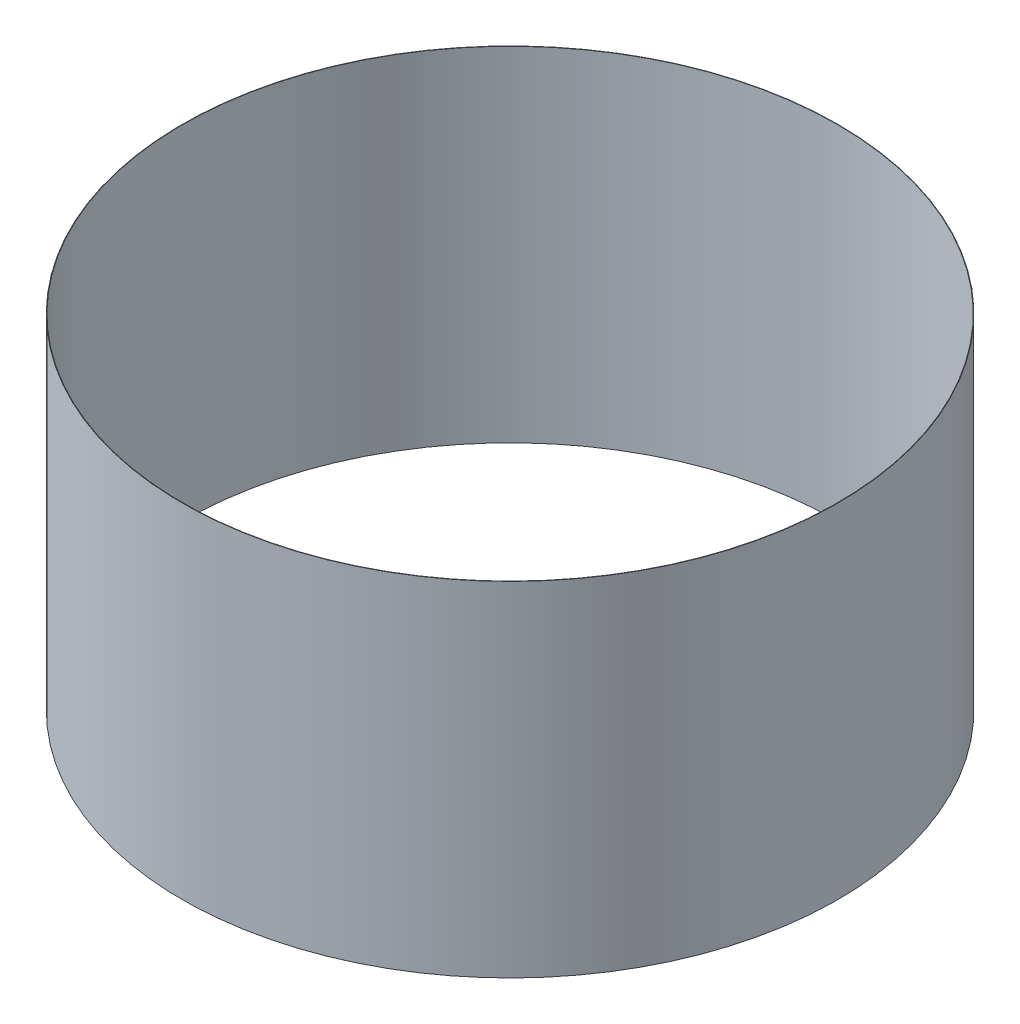
ISO-10303-21;
HEADER;
FILE_DESCRIPTION(('STEP AP214'),'2;1');
FILE_NAME('part.step','',(''),(''),'','','');
FILE_SCHEMA(('AUTOMOTIVE_DESIGN { 1 0 10303 214 1 1 1 1 }'));
ENDSEC;
DATA;
#1=APPLICATION_CONTEXT('core data for automotive mechanical design processes');
#2=APPLICATION_PROTOCOL_DEFINITION('international standard','automotive_design',2000,#1);
#3=PRODUCT_CONTEXT('',#1,'mechanical');
#4=PRODUCT('Part','Part','',(#3));
#5=PRODUCT_RELATED_PRODUCT_CATEGORY('part','',(#4));
#6=PRODUCT_DEFINITION_FORMATION('','',#4);
#7=PRODUCT_DEFINITION_CONTEXT('part definition',#1,'design');
#8=PRODUCT_DEFINITION('design','',#6,#7);
#9=PRODUCT_DEFINITION_SHAPE('','',#8);
#10=(LENGTH_UNIT() NAMED_UNIT(*) SI_UNIT(.MILLI.,.METRE.));
#11=(NAMED_UNIT(*) PLANE_ANGLE_UNIT() SI_UNIT($,.RADIAN.));
#12=(NAMED_UNIT(*) SI_UNIT($,.STERADIAN.) SOLID_ANGLE_UNIT());
#13=UNCERTAINTY_MEASURE_WITH_UNIT(LENGTH_MEASURE(1.E-05),#10,'distance_accuracy_value','');
#14=(GEOMETRIC_REPRESENTATION_CONTEXT(3) GLOBAL_UNCERTAINTY_ASSIGNED_CONTEXT((#13)) GLOBAL_UNIT_ASSIGNED_CONTEXT((#10,
#11,#12)) REPRESENTATION_CONTEXT('',''));
#15=CARTESIAN_POINT('',(0.,0.,0.));
#16=DIRECTION('',(0.,0.,1.));
#17=DIRECTION('',(1.,0.,0.));
#18=AXIS2_PLACEMENT_3D('',#15,#16,#17);
#19=CARTESIAN_POINT('',(0.,205.,0.));
#20=DIRECTION('',(0.,1.,0.));
#21=DIRECTION('',(0.,0.,1.));
#22=AXIS2_PLACEMENT_3D('',#19,#20,#21);
#23=PLANE('',#22);
#24=CARTESIAN_POINT('',(0.,205.,0.));
#25=DIRECTION('',(0.,1.,0.));
#26=DIRECTION('',(1.,0.,0.));
#27=AXIS2_PLACEMENT_3D('',#24,#25,#26);
#28=CIRCLE('',#27,195.75);
#29=CARTESIAN_POINT('',(0.,205.,-195.75));
#30=VERTEX_POINT('',#29);
#31=EDGE_CURVE('E11',#30,#30,#28,.T.);
#32=ORIENTED_EDGE('',*,*,#31,.T.);
#33=EDGE_LOOP('',(#32));
#34=FACE_BOUND('',#33,.T.);
#35=CARTESIAN_POINT('',(0.,205.,0.));
#36=DIRECTION('',(0.,1.,0.));
#37=DIRECTION('',(0.,0.,1.));
#38=AXIS2_PLACEMENT_3D('',#35,#36,#37);
#39=CIRCLE('',#38,195.5);
#40=CARTESIAN_POINT('',(0.,205.,-195.5));
#41=VERTEX_POINT('',#40);
#42=EDGE_CURVE('E48',#41,#41,#39,.T.);
#43=ORIENTED_EDGE('',*,*,#42,.F.);
#44=EDGE_LOOP('',(#43));
#45=FACE_BOUND('',#44,.T.);
#46=ADVANCED_FACE('F37',(#34,#45),#23,.T.);
#47=CARTESIAN_POINT('',(0.,0.,0.));
#48=DIRECTION('',(0.,1.,0.));
#49=DIRECTION('',(0.,0.,1.));
#50=AXIS2_PLACEMENT_3D('',#47,#48,#49);
#51=PLANE('',#50);
#52=CARTESIAN_POINT('',(0.,0.,0.));
#53=DIRECTION('',(0.,1.,0.));
#54=DIRECTION('',(1.,0.,0.));
#55=AXIS2_PLACEMENT_3D('',#52,#53,#54);
#56=CIRCLE('',#55,195.75);
#57=CARTESIAN_POINT('',(0.,0.,-195.75));
#58=VERTEX_POINT('',#57);
#59=EDGE_CURVE('E41',#58,#58,#56,.T.);
#60=ORIENTED_EDGE('',*,*,#59,.F.);
#61=EDGE_LOOP('',(#60));
#62=FACE_BOUND('',#61,.T.);
#63=CARTESIAN_POINT('',(0.,0.,0.));
#64=DIRECTION('',(0.,1.,0.));
#65=DIRECTION('',(0.,0.,1.));
#66=AXIS2_PLACEMENT_3D('',#63,#64,#65);
#67=CIRCLE('',#66,195.5);
#68=CARTESIAN_POINT('',(0.,0.,-195.5));
#69=VERTEX_POINT('',#68);
#70=EDGE_CURVE('E50',#69,#69,#67,.T.);
#71=ORIENTED_EDGE('',*,*,#70,.T.);
#72=EDGE_LOOP('',(#71));
#73=FACE_BOUND('',#72,.T.);
#74=ADVANCED_FACE('F60',(#62,#73),#51,.F.);
#75=CARTESIAN_POINT('',(0.,205.,0.));
#76=DIRECTION('',(0.,-1.,0.));
#77=DIRECTION('',(0.,0.,-1.));
#78=AXIS2_PLACEMENT_3D('',#75,#76,#77);
#79=CYLINDRICAL_SURFACE('',#78,195.75);
#80=CARTESIAN_POINT('',(0.,205.,-195.75));
#81=CARTESIAN_POINT('',(0.,202.864583333333,-195.75));
#82=CARTESIAN_POINT('',(0.,200.729166666667,-195.75));
#83=CARTESIAN_POINT('',(0.,196.458333333333,-195.75));
#84=CARTESIAN_POINT('',(0.,194.322916666667,-195.75));
#85=CARTESIAN_POINT('',(0.,190.052083333333,-195.75));
#86=CARTESIAN_POINT('',(0.,187.916666666667,-195.75));
#87=CARTESIAN_POINT('',(0.,183.645833333333,-195.75));
#88=CARTESIAN_POINT('',(0.,181.510416666667,-195.75));
#89=CARTESIAN_POINT('',(0.,177.239583333333,-195.75));
#90=CARTESIAN_POINT('',(0.,175.104166666667,-195.75));
#91=CARTESIAN_POINT('',(0.,170.833333333333,-195.75));
#92=CARTESIAN_POINT('',(0.,168.697916666667,-195.75));
#93=CARTESIAN_POINT('',(0.,164.427083333333,-195.75));
#94=CARTESIAN_POINT('',(0.,162.291666666667,-195.75));
#95=CARTESIAN_POINT('',(0.,158.020833333333,-195.75));
#96=CARTESIAN_POINT('',(0.,155.885416666667,-195.75));
#97=CARTESIAN_POINT('',(0.,151.614583333333,-195.75));
#98=CARTESIAN_POINT('',(0.,149.479166666667,-195.75));
#99=CARTESIAN_POINT('',(0.,145.208333333333,-195.75));
#100=CARTESIAN_POINT('',(0.,143.072916666667,-195.75));
#101=CARTESIAN_POINT('',(0.,138.802083333333,-195.75));
#102=CARTESIAN_POINT('',(0.,136.666666666667,-195.75));
#103=CARTESIAN_POINT('',(0.,132.395833333333,-195.75));
#104=CARTESIAN_POINT('',(0.,130.260416666667,-195.75));
#105=CARTESIAN_POINT('',(0.,125.989583333333,-195.75));
#106=CARTESIAN_POINT('',(0.,123.854166666667,-195.75));
#107=CARTESIAN_POINT('',(0.,119.583333333333,-195.75));
#108=CARTESIAN_POINT('',(0.,117.447916666667,-195.75));
#109=CARTESIAN_POINT('',(0.,113.177083333333,-195.75));
#110=CARTESIAN_POINT('',(0.,111.041666666667,-195.75));
#111=CARTESIAN_POINT('',(0.,106.770833333333,-195.75));
#112=CARTESIAN_POINT('',(0.,104.635416666667,-195.75));
#113=CARTESIAN_POINT('',(0.,100.364583333333,-195.75));
#114=CARTESIAN_POINT('',(0.,98.2291666666666,-195.75));
#115=CARTESIAN_POINT('',(0.,93.9583333333333,-195.75));
#116=CARTESIAN_POINT('',(0.,91.8229166666666,-195.75));
#117=CARTESIAN_POINT('',(0.,87.5520833333333,-195.75));
#118=CARTESIAN_POINT('',(0.,85.4166666666666,-195.75));
#119=CARTESIAN_POINT('',(0.,81.1458333333333,-195.75));
#120=CARTESIAN_POINT('',(0.,79.0104166666667,-195.75));
#121=CARTESIAN_POINT('',(0.,74.7395833333333,-195.75));
#122=CARTESIAN_POINT('',(0.,72.6041666666667,-195.75));
#123=CARTESIAN_POINT('',(0.,68.3333333333333,-195.75));
#124=CARTESIAN_POINT('',(0.,66.1979166666667,-195.75));
#125=CARTESIAN_POINT('',(0.,61.9270833333333,-195.75));
#126=CARTESIAN_POINT('',(0.,59.7916666666667,-195.75));
#127=CARTESIAN_POINT('',(0.,55.5208333333333,-195.75));
#128=CARTESIAN_POINT('',(0.,53.3854166666667,-195.75));
#129=CARTESIAN_POINT('',(0.,49.1145833333333,-195.75));
#130=CARTESIAN_POINT('',(0.,46.9791666666667,-195.75));
#131=CARTESIAN_POINT('',(0.,42.7083333333333,-195.75));
#132=CARTESIAN_POINT('',(0.,40.5729166666667,-195.75));
#133=CARTESIAN_POINT('',(0.,36.3020833333333,-195.75));
#134=CARTESIAN_POINT('',(0.,34.1666666666667,-195.75));
#135=CARTESIAN_POINT('',(0.,29.8958333333333,-195.75));
#136=CARTESIAN_POINT('',(0.,27.7604166666667,-195.75));
#137=CARTESIAN_POINT('',(0.,23.4895833333333,-195.75));
#138=CARTESIAN_POINT('',(0.,21.3541666666667,-195.75));
#139=CARTESIAN_POINT('',(0.,17.0833333333333,-195.75));
#140=CARTESIAN_POINT('',(0.,14.9479166666667,-195.75));
#141=CARTESIAN_POINT('',(0.,10.6770833333333,-195.75));
#142=CARTESIAN_POINT('',(0.,8.54166666666667,-195.75));
#143=CARTESIAN_POINT('',(0.,4.27083333333333,-195.75));
#144=CARTESIAN_POINT('',(0.,2.13541666666667,-195.75));
#145=CARTESIAN_POINT('',(0.,0.,-195.75));
#146=B_SPLINE_CURVE_WITH_KNOTS('',3,(#80,#81,#82,#83,#84,#85,#86,#87,#88,#89,#90,#91,#92,#93,
#94,#95,#96,#97,#98,#99,#100,#101,#102,#103,#104,#105,#106,#107,#108,#109,#110,#111,#112,#113,
#114,#115,#116,#117,#118,#119,#120,#121,#122,#123,#124,#125,#126,#127,#128,#129,#130,#131,#132,
#133,#134,#135,#136,#137,#138,#139,#140,#141,#142,#143,#144,#145),.UNSPECIFIED.,.F.,.F.,(4,2,2,
2,2,2,2,2,2,2,2,2,2,2,2,2,2,2,2,2,2,2,2,2,2,2,2,2,2,2,2,2,4),(0.,6.40625,12.8125,19.21875,
25.625,32.03125,38.4375,44.84375,51.25,57.65625,64.0625,70.46875,76.875,83.28125,89.6875,
96.09375,102.5,108.90625,115.3125,121.71875,128.125,134.53125,140.9375,147.34375,153.75,
160.15625,166.5625,172.96875,179.375,185.78125,192.1875,198.59375,205.),.UNSPECIFIED.);
#147=EDGE_CURVE('BSEAM39',#30,#58,#146,.T.);
#148=ORIENTED_EDGE('',*,*,#31,.F.);
#149=ORIENTED_EDGE('',*,*,#59,.T.);
#150=ORIENTED_EDGE('',*,*,#147,.T.);
#151=ORIENTED_EDGE('',*,*,#147,.F.);
#152=EDGE_LOOP('',(#148,#150,#149,#151));
#153=FACE_BOUND('',#152,.T.);
#154=ADVANCED_FACE('F39',(#153),#79,.T.);
#155=CARTESIAN_POINT('',(0.,205.,0.));
#156=DIRECTION('',(0.,-1.,0.));
#157=DIRECTION('',(0.,0.,-1.));
#158=AXIS2_PLACEMENT_3D('',#155,#156,#157);
#159=CYLINDRICAL_SURFACE('',#158,195.5);
#160=CARTESIAN_POINT('',(0.,205.,-195.5));
#161=CARTESIAN_POINT('',(0.,202.864583333333,-195.5));
#162=CARTESIAN_POINT('',(0.,200.729166666667,-195.5));
#163=CARTESIAN_POINT('',(0.,196.458333333333,-195.5));
#164=CARTESIAN_POINT('',(0.,194.322916666667,-195.5));
#165=CARTESIAN_POINT('',(0.,190.052083333333,-195.5));
#166=CARTESIAN_POINT('',(0.,187.916666666667,-195.5));
#167=CARTESIAN_POINT('',(0.,183.645833333333,-195.5));
#168=CARTESIAN_POINT('',(0.,181.510416666667,-195.5));
#169=CARTESIAN_POINT('',(0.,177.239583333333,-195.5));
#170=CARTESIAN_POINT('',(0.,175.104166666667,-195.5));
#171=CARTESIAN_POINT('',(0.,170.833333333333,-195.5));
#172=CARTESIAN_POINT('',(0.,168.697916666667,-195.5));
#173=CARTESIAN_POINT('',(0.,164.427083333333,-195.5));
#174=CARTESIAN_POINT('',(0.,162.291666666667,-195.5));
#175=CARTESIAN_POINT('',(0.,158.020833333333,-195.5));
#176=CARTESIAN_POINT('',(0.,155.885416666667,-195.5));
#177=CARTESIAN_POINT('',(0.,151.614583333333,-195.5));
#178=CARTESIAN_POINT('',(0.,149.479166666667,-195.5));
#179=CARTESIAN_POINT('',(0.,145.208333333333,-195.5));
#180=CARTESIAN_POINT('',(0.,143.072916666667,-195.5));
#181=CARTESIAN_POINT('',(0.,138.802083333333,-195.5));
#182=CARTESIAN_POINT('',(0.,136.666666666667,-195.5));
#183=CARTESIAN_POINT('',(0.,132.395833333333,-195.5));
#184=CARTESIAN_POINT('',(0.,130.260416666667,-195.5));
#185=CARTESIAN_POINT('',(0.,125.989583333333,-195.5));
#186=CARTESIAN_POINT('',(0.,123.854166666667,-195.5));
#187=CARTESIAN_POINT('',(0.,119.583333333333,-195.5));
#188=CARTESIAN_POINT('',(0.,117.447916666667,-195.5));
#189=CARTESIAN_POINT('',(0.,113.177083333333,-195.5));
#190=CARTESIAN_POINT('',(0.,111.041666666667,-195.5));
#191=CARTESIAN_POINT('',(0.,106.770833333333,-195.5));
#192=CARTESIAN_POINT('',(0.,104.635416666667,-195.5));
#193=CARTESIAN_POINT('',(0.,100.364583333333,-195.5));
#194=CARTESIAN_POINT('',(0.,98.2291666666666,-195.5));
#195=CARTESIAN_POINT('',(0.,93.9583333333333,-195.5));
#196=CARTESIAN_POINT('',(0.,91.8229166666666,-195.5));
#197=CARTESIAN_POINT('',(0.,87.5520833333333,-195.5));
#198=CARTESIAN_POINT('',(0.,85.4166666666666,-195.5));
#199=CARTESIAN_POINT('',(0.,81.1458333333333,-195.5));
#200=CARTESIAN_POINT('',(0.,79.0104166666667,-195.5));
#201=CARTESIAN_POINT('',(0.,74.7395833333333,-195.5));
#202=CARTESIAN_POINT('',(0.,72.6041666666667,-195.5));
#203=CARTESIAN_POINT('',(0.,68.3333333333333,-195.5));
#204=CARTESIAN_POINT('',(0.,66.1979166666667,-195.5));
#205=CARTESIAN_POINT('',(0.,61.9270833333333,-195.5));
#206=CARTESIAN_POINT('',(0.,59.7916666666667,-195.5));
#207=CARTESIAN_POINT('',(0.,55.5208333333333,-195.5));
#208=CARTESIAN_POINT('',(0.,53.3854166666667,-195.5));
#209=CARTESIAN_POINT('',(0.,49.1145833333333,-195.5));
#210=CARTESIAN_POINT('',(0.,46.9791666666667,-195.5));
#211=CARTESIAN_POINT('',(0.,42.7083333333333,-195.5));
#212=CARTESIAN_POINT('',(0.,40.5729166666667,-195.5));
#213=CARTESIAN_POINT('',(0.,36.3020833333333,-195.5));
#214=CARTESIAN_POINT('',(0.,34.1666666666667,-195.5));
#215=CARTESIAN_POINT('',(0.,29.8958333333333,-195.5));
#216=CARTESIAN_POINT('',(0.,27.7604166666667,-195.5));
#217=CARTESIAN_POINT('',(0.,23.4895833333333,-195.5));
#218=CARTESIAN_POINT('',(0.,21.3541666666667,-195.5));
#219=CARTESIAN_POINT('',(0.,17.0833333333333,-195.5));
#220=CARTESIAN_POINT('',(0.,14.9479166666667,-195.5));
#221=CARTESIAN_POINT('',(0.,10.6770833333333,-195.5));
#222=CARTESIAN_POINT('',(0.,8.54166666666667,-195.5));
#223=CARTESIAN_POINT('',(0.,4.27083333333333,-195.5));
#224=CARTESIAN_POINT('',(0.,2.13541666666667,-195.5));
#225=CARTESIAN_POINT('',(0.,0.,-195.5));
#226=B_SPLINE_CURVE_WITH_KNOTS('',3,(#160,#161,#162,#163,#164,#165,#166,#167,#168,#169,#170,
#171,#172,#173,#174,#175,#176,#177,#178,#179,#180,#181,#182,#183,#184,#185,#186,#187,#188,#189,
#190,#191,#192,#193,#194,#195,#196,#197,#198,#199,#200,#201,#202,#203,#204,#205,#206,#207,#208,
#209,#210,#211,#212,#213,#214,#215,#216,#217,#218,#219,#220,#221,#222,#223,#224,#225),
.UNSPECIFIED.,.F.,.F.,(4,2,2,2,2,2,2,2,2,2,2,2,2,2,2,2,2,2,2,2,2,2,2,2,2,2,2,2,2,2,2,2,4),(0.,
6.40625,12.8125,19.21875,25.625,32.03125,38.4375,44.84375,51.25,57.65625,64.0625,70.46875,
76.875,83.28125,89.6875,96.09375,102.5,108.90625,115.3125,121.71875,128.125,134.53125,140.9375,
147.34375,153.75,160.15625,166.5625,172.96875,179.375,185.78125,192.1875,198.59375,205.),.UNSPECIFIED.);
#227=EDGE_CURVE('BSEAM56',#41,#69,#226,.T.);
#228=ORIENTED_EDGE('',*,*,#42,.T.);
#229=ORIENTED_EDGE('',*,*,#70,.F.);
#230=ORIENTED_EDGE('',*,*,#227,.T.);
#231=ORIENTED_EDGE('',*,*,#227,.F.);
#232=EDGE_LOOP('',(#228,#230,#229,#231));
#233=FACE_BOUND('',#232,.T.);
#234=ADVANCED_FACE('F56',(#233),#159,.F.);
#235=CLOSED_SHELL('',(#46,#74,#154,#234));
#236=MANIFOLD_SOLID_BREP('B2',#235);
#237=ADVANCED_BREP_SHAPE_REPRESENTATION('',(#18,#236),#14);
#238=SHAPE_DEFINITION_REPRESENTATION(#9,#237);
ENDSEC;
END-ISO-10303-21;
